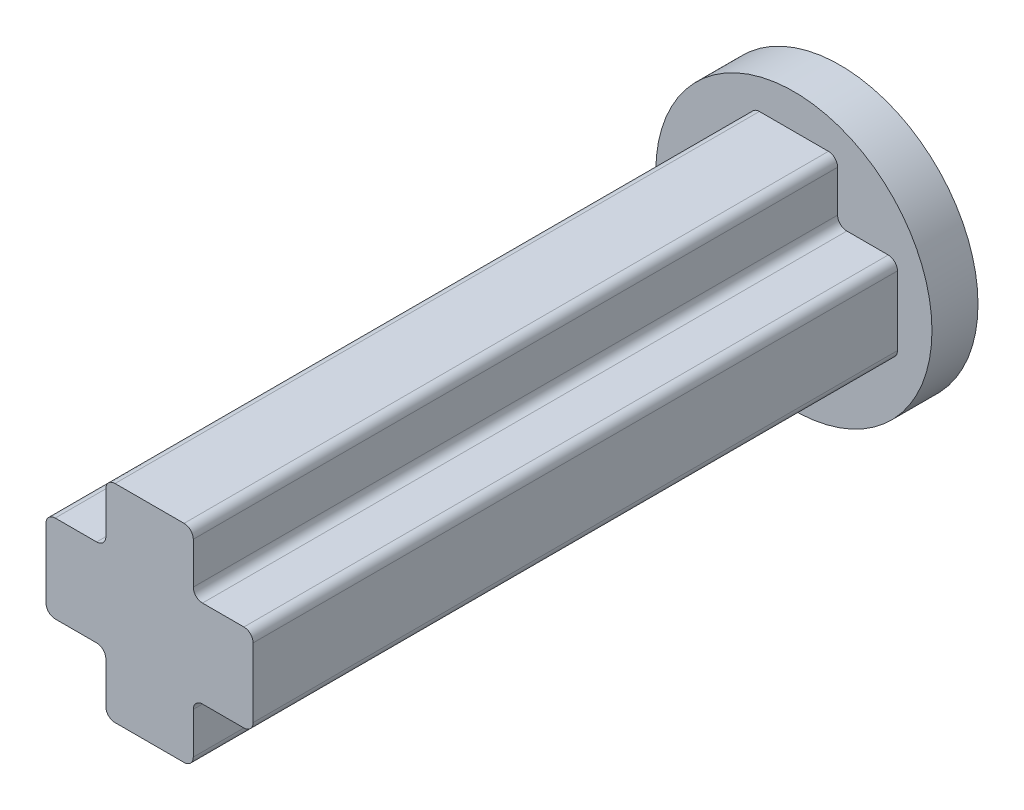
ISO-10303-21;
HEADER;
FILE_DESCRIPTION(('STEP AP214'),'2;1');
FILE_NAME('part.step','',(''),(''),'','','');
FILE_SCHEMA(('AUTOMOTIVE_DESIGN { 1 0 10303 214 1 1 1 1 }'));
ENDSEC;
DATA;
#1=APPLICATION_CONTEXT('core data for automotive mechanical design processes');
#2=APPLICATION_PROTOCOL_DEFINITION('international standard','automotive_design',2000,#1);
#3=PRODUCT_CONTEXT('',#1,'mechanical');
#4=PRODUCT('Part','Part','',(#3));
#5=PRODUCT_RELATED_PRODUCT_CATEGORY('part','',(#4));
#6=PRODUCT_DEFINITION_FORMATION('','',#4);
#7=PRODUCT_DEFINITION_CONTEXT('part definition',#1,'design');
#8=PRODUCT_DEFINITION('design','',#6,#7);
#9=PRODUCT_DEFINITION_SHAPE('','',#8);
#10=(LENGTH_UNIT() NAMED_UNIT(*) SI_UNIT(.MILLI.,.METRE.));
#11=(NAMED_UNIT(*) PLANE_ANGLE_UNIT() SI_UNIT($,.RADIAN.));
#12=(NAMED_UNIT(*) SI_UNIT($,.STERADIAN.) SOLID_ANGLE_UNIT());
#13=UNCERTAINTY_MEASURE_WITH_UNIT(LENGTH_MEASURE(1.E-05),#10,'distance_accuracy_value','');
#14=(GEOMETRIC_REPRESENTATION_CONTEXT(3) GLOBAL_UNCERTAINTY_ASSIGNED_CONTEXT((#13)) GLOBAL_UNIT_ASSIGNED_CONTEXT((#10,
#11,#12)) REPRESENTATION_CONTEXT('',''));
#15=CARTESIAN_POINT('',(0.,0.,0.));
#16=DIRECTION('',(0.,0.,1.));
#17=DIRECTION('',(1.,0.,0.));
#18=AXIS2_PLACEMENT_3D('',#15,#16,#17);
#19=CARTESIAN_POINT('',(0.,0.,1.));
#20=DIRECTION('',(0.,0.,-1.));
#21=DIRECTION('',(-1.,0.,0.));
#22=AXIS2_PLACEMENT_3D('',#19,#20,#21);
#23=CYLINDRICAL_SURFACE('',#22,3.);
#24=CARTESIAN_POINT('',(0.,0.,1.));
#25=DIRECTION('',(0.,0.,1.));
#26=DIRECTION('',(1.,0.,0.));
#27=AXIS2_PLACEMENT_3D('',#24,#25,#26);
#28=CIRCLE('',#27,3.);
#29=CARTESIAN_POINT('',(3.,0.,1.));
#30=VERTEX_POINT('',#29);
#31=EDGE_CURVE('E11',#30,#30,#28,.T.);
#32=ORIENTED_EDGE('',*,*,#31,.F.);
#33=EDGE_LOOP('',(#32));
#34=FACE_BOUND('',#33,.T.);
#35=CARTESIAN_POINT('',(0.,0.,0.));
#36=DIRECTION('',(0.,0.,1.));
#37=DIRECTION('',(1.,0.,0.));
#38=AXIS2_PLACEMENT_3D('',#35,#36,#37);
#39=CIRCLE('',#38,3.);
#40=CARTESIAN_POINT('',(3.,0.,0.));
#41=VERTEX_POINT('',#40);
#42=EDGE_CURVE('E45',#41,#41,#39,.T.);
#43=ORIENTED_EDGE('',*,*,#42,.T.);
#44=EDGE_LOOP('',(#43));
#45=FACE_BOUND('',#44,.T.);
#46=ADVANCED_FACE('F39',(#34,#45),#23,.T.);
#47=CARTESIAN_POINT('',(0.,0.,1.));
#48=DIRECTION('',(0.,0.,1.));
#49=DIRECTION('',(1.,0.,0.));
#50=AXIS2_PLACEMENT_3D('',#47,#48,#49);
#51=PLANE('',#50);
#52=CARTESIAN_POINT('',(2.05,-0.749999999999991,1.));
#53=DIRECTION('',(0.,0.,1.));
#54=DIRECTION('',(1.,0.,0.));
#55=AXIS2_PLACEMENT_3D('',#52,#53,#54);
#56=CIRCLE('',#55,0.2);
#57=CARTESIAN_POINT('',(2.05,-0.949999999999991,1.));
#58=VERTEX_POINT('',#57);
#59=CARTESIAN_POINT('',(2.25,-0.749999999999989,1.));
#60=VERTEX_POINT('',#59);
#61=EDGE_CURVE('E52',#58,#60,#56,.T.);
#62=ORIENTED_EDGE('',*,*,#61,.F.);
#63=DIRECTION('',(-1.,0.,0.));
#64=VECTOR('',#63,1.);
#65=CARTESIAN_POINT('',(2.05,-0.949999999999991,1.));
#66=LINE('',#65,#64);
#67=CARTESIAN_POINT('',(1.15,-0.949999999999995,1.));
#68=VERTEX_POINT('',#67);
#69=EDGE_CURVE('E289',#58,#68,#66,.T.);
#70=ORIENTED_EDGE('',*,*,#69,.T.);
#71=CARTESIAN_POINT('',(1.15,-1.15,1.));
#72=DIRECTION('',(0.,0.,1.));
#73=DIRECTION('',(1.,0.,0.));
#74=AXIS2_PLACEMENT_3D('',#71,#72,#73);
#75=CIRCLE('',#74,0.2);
#76=CARTESIAN_POINT('',(0.950000000000004,-1.15,1.));
#77=VERTEX_POINT('',#76);
#78=EDGE_CURVE('E286',#68,#77,#75,.T.);
#79=ORIENTED_EDGE('',*,*,#78,.T.);
#80=DIRECTION('',(0.,-1.,0.));
#81=VECTOR('',#80,1.);
#82=CARTESIAN_POINT('',(0.950000000000004,-1.15,1.));
#83=LINE('',#82,#81);
#84=CARTESIAN_POINT('',(0.950000000000008,-2.04999999999999,1.));
#85=VERTEX_POINT('',#84);
#86=EDGE_CURVE('E209',#77,#85,#83,.T.);
#87=ORIENTED_EDGE('',*,*,#86,.T.);
#88=CARTESIAN_POINT('',(0.750000000000008,-2.05,1.));
#89=DIRECTION('',(0.,0.,1.));
#90=DIRECTION('',(1.,0.,0.));
#91=AXIS2_PLACEMENT_3D('',#88,#89,#90);
#92=CIRCLE('',#91,0.2);
#93=CARTESIAN_POINT('',(0.750000000000007,-2.25,1.));
#94=VERTEX_POINT('',#93);
#95=EDGE_CURVE('E281',#94,#85,#92,.T.);
#96=ORIENTED_EDGE('',*,*,#95,.F.);
#97=DIRECTION('',(-1.,0.,0.));
#98=VECTOR('',#97,1.);
#99=CARTESIAN_POINT('',(0.750000000000007,-2.25,1.));
#100=LINE('',#99,#98);
#101=CARTESIAN_POINT('',(-0.749999999999998,-2.25,1.));
#102=VERTEX_POINT('',#101);
#103=EDGE_CURVE('E282',#94,#102,#100,.T.);
#104=ORIENTED_EDGE('',*,*,#103,.T.);
#105=CARTESIAN_POINT('',(-0.75,-2.05,1.));
#106=DIRECTION('',(0.,0.,1.));
#107=DIRECTION('',(1.,0.,0.));
#108=AXIS2_PLACEMENT_3D('',#105,#106,#107);
#109=CIRCLE('',#108,0.2);
#110=CARTESIAN_POINT('',(-0.95,-2.05,1.));
#111=VERTEX_POINT('',#110);
#112=EDGE_CURVE('E277',#111,#102,#109,.T.);
#113=ORIENTED_EDGE('',*,*,#112,.F.);
#114=DIRECTION('',(0.,-1.,0.));
#115=VECTOR('',#114,1.);
#116=CARTESIAN_POINT('',(-0.95,-1.15,1.));
#117=LINE('',#116,#115);
#118=CARTESIAN_POINT('',(-0.95,-1.15,1.));
#119=VERTEX_POINT('',#118);
#120=EDGE_CURVE('E276',#119,#111,#117,.T.);
#121=ORIENTED_EDGE('',*,*,#120,.F.);
#122=CARTESIAN_POINT('',(-1.15,-1.15,1.));
#123=DIRECTION('',(0.,0.,-1.));
#124=DIRECTION('',(-1.,0.,0.));
#125=AXIS2_PLACEMENT_3D('',#122,#123,#124);
#126=CIRCLE('',#125,0.2);
#127=CARTESIAN_POINT('',(-1.15,-0.949999999999996,1.));
#128=VERTEX_POINT('',#127);
#129=EDGE_CURVE('E272',#128,#119,#126,.T.);
#130=ORIENTED_EDGE('',*,*,#129,.F.);
#131=DIRECTION('',(1.,0.,0.));
#132=VECTOR('',#131,1.);
#133=CARTESIAN_POINT('',(-2.05,-0.949999999999996,1.));
#134=LINE('',#133,#132);
#135=CARTESIAN_POINT('',(-2.05,-0.949999999999996,1.));
#136=VERTEX_POINT('',#135);
#137=EDGE_CURVE('E275',#136,#128,#134,.T.);
#138=ORIENTED_EDGE('',*,*,#137,.F.);
#139=CARTESIAN_POINT('',(-2.05,-0.749999999999996,1.));
#140=DIRECTION('',(0.,0.,1.));
#141=DIRECTION('',(1.,0.,0.));
#142=AXIS2_PLACEMENT_3D('',#139,#140,#141);
#143=CIRCLE('',#142,0.2);
#144=CARTESIAN_POINT('',(-2.25,-0.749999999999995,1.));
#145=VERTEX_POINT('',#144);
#146=EDGE_CURVE('E269',#145,#136,#143,.T.);
#147=ORIENTED_EDGE('',*,*,#146,.F.);
#148=DIRECTION('',(0.,1.,0.));
#149=VECTOR('',#148,1.);
#150=CARTESIAN_POINT('',(-2.25,-0.749999999999995,1.));
#151=LINE('',#150,#149);
#152=CARTESIAN_POINT('',(-2.25,0.749999999999998,1.));
#153=VERTEX_POINT('',#152);
#154=EDGE_CURVE('E270',#145,#153,#151,.T.);
#155=ORIENTED_EDGE('',*,*,#154,.T.);
#156=CARTESIAN_POINT('',(-2.05,0.75,1.));
#157=DIRECTION('',(0.,0.,-1.));
#158=DIRECTION('',(-1.,0.,0.));
#159=AXIS2_PLACEMENT_3D('',#156,#157,#158);
#160=CIRCLE('',#159,0.2);
#161=CARTESIAN_POINT('',(-2.05,0.95,1.));
#162=VERTEX_POINT('',#161);
#163=EDGE_CURVE('E264',#153,#162,#160,.T.);
#164=ORIENTED_EDGE('',*,*,#163,.T.);
#165=DIRECTION('',(-1.,0.,0.));
#166=VECTOR('',#165,1.);
#167=CARTESIAN_POINT('',(-1.15,0.95,1.));
#168=LINE('',#167,#166);
#169=CARTESIAN_POINT('',(-1.15,0.95,1.));
#170=VERTEX_POINT('',#169);
#171=EDGE_CURVE('E263',#170,#162,#168,.T.);
#172=ORIENTED_EDGE('',*,*,#171,.F.);
#173=CARTESIAN_POINT('',(-1.15,1.15,1.));
#174=DIRECTION('',(0.,0.,-1.));
#175=DIRECTION('',(-1.,0.,0.));
#176=AXIS2_PLACEMENT_3D('',#173,#174,#175);
#177=CIRCLE('',#176,0.2);
#178=CARTESIAN_POINT('',(-0.95,1.15,1.));
#179=VERTEX_POINT('',#178);
#180=EDGE_CURVE('E260',#179,#170,#177,.T.);
#181=ORIENTED_EDGE('',*,*,#180,.F.);
#182=DIRECTION('',(0.,-1.,0.));
#183=VECTOR('',#182,1.);
#184=CARTESIAN_POINT('',(-0.95,2.05,1.));
#185=LINE('',#184,#183);
#186=CARTESIAN_POINT('',(-0.95,2.05,1.));
#187=VERTEX_POINT('',#186);
#188=EDGE_CURVE('E257',#187,#179,#185,.T.);
#189=ORIENTED_EDGE('',*,*,#188,.F.);
#190=CARTESIAN_POINT('',(-0.75,2.05,1.));
#191=DIRECTION('',(0.,0.,-1.));
#192=DIRECTION('',(-1.,0.,0.));
#193=AXIS2_PLACEMENT_3D('',#190,#191,#192);
#194=CIRCLE('',#193,0.2);
#195=CARTESIAN_POINT('',(-0.749999999999999,2.25,1.));
#196=VERTEX_POINT('',#195);
#197=EDGE_CURVE('E252',#187,#196,#194,.T.);
#198=ORIENTED_EDGE('',*,*,#197,.T.);
#199=DIRECTION('',(1.,0.,0.));
#200=VECTOR('',#199,1.);
#201=CARTESIAN_POINT('',(-0.749999999999999,2.25,1.));
#202=LINE('',#201,#200);
#203=CARTESIAN_POINT('',(0.750000000000002,2.25,1.));
#204=VERTEX_POINT('',#203);
#205=EDGE_CURVE('E253',#196,#204,#202,.T.);
#206=ORIENTED_EDGE('',*,*,#205,.T.);
#207=CARTESIAN_POINT('',(0.750000000000003,2.05,1.));
#208=DIRECTION('',(0.,0.,-1.));
#209=DIRECTION('',(-1.,0.,0.));
#210=AXIS2_PLACEMENT_3D('',#207,#208,#209);
#211=CIRCLE('',#210,0.2);
#212=CARTESIAN_POINT('',(0.950000000000004,2.05,1.));
#213=VERTEX_POINT('',#212);
#214=EDGE_CURVE('E246',#204,#213,#211,.T.);
#215=ORIENTED_EDGE('',*,*,#214,.T.);
#216=DIRECTION('',(0.,-1.,0.));
#217=VECTOR('',#216,1.);
#218=CARTESIAN_POINT('',(0.950000000000004,2.05,1.));
#219=LINE('',#218,#217);
#220=CARTESIAN_POINT('',(0.950000000000004,1.15,1.));
#221=VERTEX_POINT('',#220);
#222=EDGE_CURVE('E244',#213,#221,#219,.T.);
#223=ORIENTED_EDGE('',*,*,#222,.T.);
#224=CARTESIAN_POINT('',(1.15,1.15,1.));
#225=DIRECTION('',(0.,0.,1.));
#226=DIRECTION('',(1.,0.,0.));
#227=AXIS2_PLACEMENT_3D('',#224,#225,#226);
#228=CIRCLE('',#227,0.2);
#229=CARTESIAN_POINT('',(1.15,0.95,1.));
#230=VERTEX_POINT('',#229);
#231=EDGE_CURVE('E245',#221,#230,#228,.T.);
#232=ORIENTED_EDGE('',*,*,#231,.T.);
#233=DIRECTION('',(1.,0.,0.));
#234=VECTOR('',#233,1.);
#235=CARTESIAN_POINT('',(1.15000000000001,0.95,1.));
#236=LINE('',#235,#234);
#237=CARTESIAN_POINT('',(2.05,0.95,1.));
#238=VERTEX_POINT('',#237);
#239=EDGE_CURVE('E236',#230,#238,#236,.T.);
#240=ORIENTED_EDGE('',*,*,#239,.T.);
#241=CARTESIAN_POINT('',(2.05,0.75,1.));
#242=DIRECTION('',(0.,0.,-1.));
#243=DIRECTION('',(-1.,0.,0.));
#244=AXIS2_PLACEMENT_3D('',#241,#242,#243);
#245=CIRCLE('',#244,0.2);
#246=CARTESIAN_POINT('',(2.25,0.749999999999999,1.));
#247=VERTEX_POINT('',#246);
#248=EDGE_CURVE('E237',#238,#247,#245,.T.);
#249=ORIENTED_EDGE('',*,*,#248,.T.);
#250=DIRECTION('',(0.,-1.,0.));
#251=VECTOR('',#250,1.);
#252=CARTESIAN_POINT('',(2.25,0.749999999999999,1.));
#253=LINE('',#252,#251);
#254=EDGE_CURVE('E232',#247,#60,#253,.T.);
#255=ORIENTED_EDGE('',*,*,#254,.T.);
#256=EDGE_LOOP('',(#62,#70,#79,#87,#96,#104,#113,#121,#130,#138,#147,#155,#164,#172,#181,#189,
#198,#206,#215,#223,#232,#240,#249,#255));
#257=FACE_BOUND('',#256,.T.);
#258=ORIENTED_EDGE('',*,*,#31,.T.);
#259=EDGE_LOOP('',(#258));
#260=FACE_BOUND('',#259,.T.);
#261=ADVANCED_FACE('F353',(#257,#260),#51,.T.);
#262=CARTESIAN_POINT('',(0.,0.,0.));
#263=DIRECTION('',(0.,0.,1.));
#264=DIRECTION('',(1.,0.,0.));
#265=AXIS2_PLACEMENT_3D('',#262,#263,#264);
#266=PLANE('',#265);
#267=ORIENTED_EDGE('',*,*,#42,.F.);
#268=EDGE_LOOP('',(#267));
#269=FACE_BOUND('',#268,.T.);
#270=ADVANCED_FACE('F346',(#269),#266,.F.);
#271=CARTESIAN_POINT('',(2.05,-0.749999999999991,15.));
#272=DIRECTION('',(0.,0.,-1.));
#273=DIRECTION('',(-1.,0.,0.));
#274=AXIS2_PLACEMENT_3D('',#271,#272,#273);
#275=CYLINDRICAL_SURFACE('',#274,0.2);
#276=ORIENTED_EDGE('',*,*,#61,.T.);
#277=DIRECTION('',(0.,0.,-1.));
#278=VECTOR('',#277,1.);
#279=CARTESIAN_POINT('',(2.25,-0.749999999999989,15.));
#280=LINE('',#279,#278);
#281=CARTESIAN_POINT('',(2.25,-0.749999999999989,15.));
#282=VERTEX_POINT('',#281);
#283=EDGE_CURVE('E338',#282,#60,#280,.T.);
#284=ORIENTED_EDGE('',*,*,#283,.F.);
#285=CARTESIAN_POINT('',(2.05,-0.749999999999991,15.));
#286=DIRECTION('',(0.,0.,1.));
#287=DIRECTION('',(1.,0.,0.));
#288=AXIS2_PLACEMENT_3D('',#285,#286,#287);
#289=CIRCLE('',#288,0.2);
#290=CARTESIAN_POINT('',(2.05,-0.949999999999991,15.));
#291=VERTEX_POINT('',#290);
#292=EDGE_CURVE('E141',#291,#282,#289,.T.);
#293=ORIENTED_EDGE('',*,*,#292,.F.);
#294=DIRECTION('',(0.,0.,-1.));
#295=VECTOR('',#294,1.);
#296=CARTESIAN_POINT('',(2.05,-0.949999999999991,15.));
#297=LINE('',#296,#295);
#298=EDGE_CURVE('E63',#291,#58,#297,.T.);
#299=ORIENTED_EDGE('',*,*,#298,.T.);
#300=EDGE_LOOP('',(#276,#284,#293,#299));
#301=FACE_BOUND('',#300,.T.);
#302=ADVANCED_FACE('F349',(#301),#275,.T.);
#303=CARTESIAN_POINT('',(2.25,0.749999999999999,15.));
#304=DIRECTION('',(1.,0.,0.));
#305=DIRECTION('',(0.,1.,0.));
#306=AXIS2_PLACEMENT_3D('',#303,#304,#305);
#307=PLANE('',#306);
#308=ORIENTED_EDGE('',*,*,#254,.F.);
#309=DIRECTION('',(0.,0.,-1.));
#310=VECTOR('',#309,1.);
#311=CARTESIAN_POINT('',(2.25,0.749999999999999,15.));
#312=LINE('',#311,#310);
#313=CARTESIAN_POINT('',(2.25,0.749999999999999,15.));
#314=VERTEX_POINT('',#313);
#315=EDGE_CURVE('E336',#314,#247,#312,.T.);
#316=ORIENTED_EDGE('',*,*,#315,.F.);
#317=DIRECTION('',(0.,-1.,0.));
#318=VECTOR('',#317,1.);
#319=CARTESIAN_POINT('',(2.25,0.749999999999999,15.));
#320=LINE('',#319,#318);
#321=EDGE_CURVE('E616',#314,#282,#320,.T.);
#322=ORIENTED_EDGE('',*,*,#321,.T.);
#323=ORIENTED_EDGE('',*,*,#283,.T.);
#324=EDGE_LOOP('',(#308,#316,#322,#323));
#325=FACE_BOUND('',#324,.T.);
#326=ADVANCED_FACE('F360',(#325),#307,.T.);
#327=CARTESIAN_POINT('',(2.05,0.75,15.));
#328=DIRECTION('',(0.,0.,-1.));
#329=DIRECTION('',(-1.,0.,0.));
#330=AXIS2_PLACEMENT_3D('',#327,#328,#329);
#331=CYLINDRICAL_SURFACE('',#330,0.2);
#332=ORIENTED_EDGE('',*,*,#248,.F.);
#333=DIRECTION('',(0.,0.,-1.));
#334=VECTOR('',#333,1.);
#335=CARTESIAN_POINT('',(2.05,0.95,15.));
#336=LINE('',#335,#334);
#337=CARTESIAN_POINT('',(2.05,0.95,15.));
#338=VERTEX_POINT('',#337);
#339=EDGE_CURVE('E337',#338,#238,#336,.T.);
#340=ORIENTED_EDGE('',*,*,#339,.F.);
#341=CARTESIAN_POINT('',(2.05,0.75,15.));
#342=DIRECTION('',(0.,0.,-1.));
#343=DIRECTION('',(-1.,0.,0.));
#344=AXIS2_PLACEMENT_3D('',#341,#342,#343);
#345=CIRCLE('',#344,0.2);
#346=EDGE_CURVE('E625',#338,#314,#345,.T.);
#347=ORIENTED_EDGE('',*,*,#346,.T.);
#348=ORIENTED_EDGE('',*,*,#315,.T.);
#349=EDGE_LOOP('',(#332,#340,#347,#348));
#350=FACE_BOUND('',#349,.T.);
#351=ADVANCED_FACE('F392',(#350),#331,.T.);
#352=CARTESIAN_POINT('',(1.15000000000001,0.95,15.));
#353=DIRECTION('',(0.,1.,0.));
#354=DIRECTION('',(0.,0.,1.));
#355=AXIS2_PLACEMENT_3D('',#352,#353,#354);
#356=PLANE('',#355);
#357=ORIENTED_EDGE('',*,*,#239,.F.);
#358=DIRECTION('',(0.,0.,-1.));
#359=VECTOR('',#358,1.);
#360=CARTESIAN_POINT('',(1.15,0.95,15.));
#361=LINE('',#360,#359);
#362=CARTESIAN_POINT('',(1.15,0.95,15.));
#363=VERTEX_POINT('',#362);
#364=EDGE_CURVE('E332',#363,#230,#361,.T.);
#365=ORIENTED_EDGE('',*,*,#364,.F.);
#366=DIRECTION('',(1.,0.,0.));
#367=VECTOR('',#366,1.);
#368=CARTESIAN_POINT('',(1.15000000000001,0.95,15.));
#369=LINE('',#368,#367);
#370=EDGE_CURVE('E622',#363,#338,#369,.T.);
#371=ORIENTED_EDGE('',*,*,#370,.T.);
#372=ORIENTED_EDGE('',*,*,#339,.T.);
#373=EDGE_LOOP('',(#357,#365,#371,#372));
#374=FACE_BOUND('',#373,.T.);
#375=ADVANCED_FACE('F401',(#374),#356,.T.);
#376=CARTESIAN_POINT('',(1.15,1.15,15.));
#377=DIRECTION('',(0.,0.,-1.));
#378=DIRECTION('',(-1.,0.,0.));
#379=AXIS2_PLACEMENT_3D('',#376,#377,#378);
#380=CYLINDRICAL_SURFACE('',#379,0.2);
#381=ORIENTED_EDGE('',*,*,#231,.F.);
#382=DIRECTION('',(0.,0.,-1.));
#383=VECTOR('',#382,1.);
#384=CARTESIAN_POINT('',(0.950000000000004,1.15,15.));
#385=LINE('',#384,#383);
#386=CARTESIAN_POINT('',(0.950000000000004,1.15,15.));
#387=VERTEX_POINT('',#386);
#388=EDGE_CURVE('E335',#387,#221,#385,.T.);
#389=ORIENTED_EDGE('',*,*,#388,.F.);
#390=CARTESIAN_POINT('',(1.15,1.15,15.));
#391=DIRECTION('',(0.,0.,1.));
#392=DIRECTION('',(1.,0.,0.));
#393=AXIS2_PLACEMENT_3D('',#390,#391,#392);
#394=CIRCLE('',#393,0.2);
#395=EDGE_CURVE('E630',#387,#363,#394,.T.);
#396=ORIENTED_EDGE('',*,*,#395,.T.);
#397=ORIENTED_EDGE('',*,*,#364,.T.);
#398=EDGE_LOOP('',(#381,#389,#396,#397));
#399=FACE_BOUND('',#398,.T.);
#400=ADVANCED_FACE('F411',(#399),#380,.F.);
#401=CARTESIAN_POINT('',(0.950000000000004,2.05,15.));
#402=DIRECTION('',(1.,0.,0.));
#403=DIRECTION('',(0.,0.,-1.));
#404=AXIS2_PLACEMENT_3D('',#401,#402,#403);
#405=PLANE('',#404);
#406=ORIENTED_EDGE('',*,*,#222,.F.);
#407=DIRECTION('',(0.,0.,-1.));
#408=VECTOR('',#407,1.);
#409=CARTESIAN_POINT('',(0.950000000000004,2.05,15.));
#410=LINE('',#409,#408);
#411=CARTESIAN_POINT('',(0.950000000000004,2.05,15.));
#412=VERTEX_POINT('',#411);
#413=EDGE_CURVE('E328',#412,#213,#410,.T.);
#414=ORIENTED_EDGE('',*,*,#413,.F.);
#415=DIRECTION('',(0.,-1.,0.));
#416=VECTOR('',#415,1.);
#417=CARTESIAN_POINT('',(0.950000000000004,2.05,15.));
#418=LINE('',#417,#416);
#419=EDGE_CURVE('E633',#412,#387,#418,.T.);
#420=ORIENTED_EDGE('',*,*,#419,.T.);
#421=ORIENTED_EDGE('',*,*,#388,.T.);
#422=EDGE_LOOP('',(#406,#414,#420,#421));
#423=FACE_BOUND('',#422,.T.);
#424=ADVANCED_FACE('F423',(#423),#405,.T.);
#425=CARTESIAN_POINT('',(0.750000000000003,2.05,15.));
#426=DIRECTION('',(0.,0.,-1.));
#427=DIRECTION('',(-1.,0.,0.));
#428=AXIS2_PLACEMENT_3D('',#425,#426,#427);
#429=CYLINDRICAL_SURFACE('',#428,0.2);
#430=ORIENTED_EDGE('',*,*,#214,.F.);
#431=DIRECTION('',(0.,0.,-1.));
#432=VECTOR('',#431,1.);
#433=CARTESIAN_POINT('',(0.750000000000002,2.25,15.));
#434=LINE('',#433,#432);
#435=CARTESIAN_POINT('',(0.750000000000002,2.25,15.));
#436=VERTEX_POINT('',#435);
#437=EDGE_CURVE('E329',#436,#204,#434,.T.);
#438=ORIENTED_EDGE('',*,*,#437,.F.);
#439=CARTESIAN_POINT('',(0.750000000000003,2.05,15.));
#440=DIRECTION('',(0.,0.,-1.));
#441=DIRECTION('',(-1.,0.,0.));
#442=AXIS2_PLACEMENT_3D('',#439,#440,#441);
#443=CIRCLE('',#442,0.2);
#444=EDGE_CURVE('E636',#436,#412,#443,.T.);
#445=ORIENTED_EDGE('',*,*,#444,.T.);
#446=ORIENTED_EDGE('',*,*,#413,.T.);
#447=EDGE_LOOP('',(#430,#438,#445,#446));
#448=FACE_BOUND('',#447,.T.);
#449=ADVANCED_FACE('F433',(#448),#429,.T.);
#450=CARTESIAN_POINT('',(-0.749999999999999,2.25,15.));
#451=DIRECTION('',(0.,1.,0.));
#452=DIRECTION('',(0.,0.,1.));
#453=AXIS2_PLACEMENT_3D('',#450,#451,#452);
#454=PLANE('',#453);
#455=ORIENTED_EDGE('',*,*,#205,.F.);
#456=DIRECTION('',(0.,0.,-1.));
#457=VECTOR('',#456,1.);
#458=CARTESIAN_POINT('',(-0.749999999999999,2.25,15.));
#459=LINE('',#458,#457);
#460=CARTESIAN_POINT('',(-0.749999999999999,2.25,15.));
#461=VERTEX_POINT('',#460);
#462=EDGE_CURVE('E327',#461,#196,#459,.T.);
#463=ORIENTED_EDGE('',*,*,#462,.F.);
#464=DIRECTION('',(1.,0.,0.));
#465=VECTOR('',#464,1.);
#466=CARTESIAN_POINT('',(-0.749999999999999,2.25,15.));
#467=LINE('',#466,#465);
#468=EDGE_CURVE('E638',#461,#436,#467,.T.);
#469=ORIENTED_EDGE('',*,*,#468,.T.);
#470=ORIENTED_EDGE('',*,*,#437,.T.);
#471=EDGE_LOOP('',(#455,#463,#469,#470));
#472=FACE_BOUND('',#471,.T.);
#473=ADVANCED_FACE('F443',(#472),#454,.T.);
#474=CARTESIAN_POINT('',(-0.75,2.05,15.));
#475=DIRECTION('',(0.,0.,-1.));
#476=DIRECTION('',(-1.,0.,0.));
#477=AXIS2_PLACEMENT_3D('',#474,#475,#476);
#478=CYLINDRICAL_SURFACE('',#477,0.2);
#479=ORIENTED_EDGE('',*,*,#197,.F.);
#480=DIRECTION('',(0.,0.,-1.));
#481=VECTOR('',#480,1.);
#482=CARTESIAN_POINT('',(-0.95,2.05,15.));
#483=LINE('',#482,#481);
#484=CARTESIAN_POINT('',(-0.95,2.05,15.));
#485=VERTEX_POINT('',#484);
#486=EDGE_CURVE('E323',#485,#187,#483,.T.);
#487=ORIENTED_EDGE('',*,*,#486,.F.);
#488=CARTESIAN_POINT('',(-0.75,2.05,15.));
#489=DIRECTION('',(0.,0.,-1.));
#490=DIRECTION('',(-1.,0.,0.));
#491=AXIS2_PLACEMENT_3D('',#488,#489,#490);
#492=CIRCLE('',#491,0.2);
#493=EDGE_CURVE('E645',#485,#461,#492,.T.);
#494=ORIENTED_EDGE('',*,*,#493,.T.);
#495=ORIENTED_EDGE('',*,*,#462,.T.);
#496=EDGE_LOOP('',(#479,#487,#494,#495));
#497=FACE_BOUND('',#496,.T.);
#498=ADVANCED_FACE('F451',(#497),#478,.T.);
#499=CARTESIAN_POINT('',(-0.95,2.05,15.));
#500=DIRECTION('',(1.,0.,0.));
#501=DIRECTION('',(0.,0.,-1.));
#502=AXIS2_PLACEMENT_3D('',#499,#500,#501);
#503=PLANE('',#502);
#504=ORIENTED_EDGE('',*,*,#188,.T.);
#505=DIRECTION('',(0.,0.,-1.));
#506=VECTOR('',#505,1.);
#507=CARTESIAN_POINT('',(-0.95,1.15,15.));
#508=LINE('',#507,#506);
#509=CARTESIAN_POINT('',(-0.95,1.15,15.));
#510=VERTEX_POINT('',#509);
#511=EDGE_CURVE('E321',#510,#179,#508,.T.);
#512=ORIENTED_EDGE('',*,*,#511,.F.);
#513=DIRECTION('',(0.,-1.,0.));
#514=VECTOR('',#513,1.);
#515=CARTESIAN_POINT('',(-0.95,2.05,15.));
#516=LINE('',#515,#514);
#517=EDGE_CURVE('E643',#485,#510,#516,.T.);
#518=ORIENTED_EDGE('',*,*,#517,.F.);
#519=ORIENTED_EDGE('',*,*,#486,.T.);
#520=EDGE_LOOP('',(#504,#512,#518,#519));
#521=FACE_BOUND('',#520,.T.);
#522=ADVANCED_FACE('F462',(#521),#503,.F.);
#523=CARTESIAN_POINT('',(-1.15,1.15,15.));
#524=DIRECTION('',(0.,0.,-1.));
#525=DIRECTION('',(-1.,0.,0.));
#526=AXIS2_PLACEMENT_3D('',#523,#524,#525);
#527=CYLINDRICAL_SURFACE('',#526,0.2);
#528=ORIENTED_EDGE('',*,*,#180,.T.);
#529=DIRECTION('',(0.,0.,-1.));
#530=VECTOR('',#529,1.);
#531=CARTESIAN_POINT('',(-1.15,0.95,15.));
#532=LINE('',#531,#530);
#533=CARTESIAN_POINT('',(-1.15,0.95,15.));
#534=VERTEX_POINT('',#533);
#535=EDGE_CURVE('E318',#534,#170,#532,.T.);
#536=ORIENTED_EDGE('',*,*,#535,.F.);
#537=CARTESIAN_POINT('',(-1.15,1.15,15.));
#538=DIRECTION('',(0.,0.,-1.));
#539=DIRECTION('',(-1.,0.,0.));
#540=AXIS2_PLACEMENT_3D('',#537,#538,#539);
#541=CIRCLE('',#540,0.2);
#542=EDGE_CURVE('E650',#510,#534,#541,.T.);
#543=ORIENTED_EDGE('',*,*,#542,.F.);
#544=ORIENTED_EDGE('',*,*,#511,.T.);
#545=EDGE_LOOP('',(#528,#536,#543,#544));
#546=FACE_BOUND('',#545,.T.);
#547=ADVANCED_FACE('F472',(#546),#527,.F.);
#548=CARTESIAN_POINT('',(-1.15,0.95,15.));
#549=DIRECTION('',(0.,-1.,0.));
#550=DIRECTION('',(0.,0.,-1.));
#551=AXIS2_PLACEMENT_3D('',#548,#549,#550);
#552=PLANE('',#551);
#553=ORIENTED_EDGE('',*,*,#171,.T.);
#554=DIRECTION('',(0.,0.,-1.));
#555=VECTOR('',#554,1.);
#556=CARTESIAN_POINT('',(-2.05,0.95,15.));
#557=LINE('',#556,#555);
#558=CARTESIAN_POINT('',(-2.05,0.95,15.));
#559=VERTEX_POINT('',#558);
#560=EDGE_CURVE('E316',#559,#162,#557,.T.);
#561=ORIENTED_EDGE('',*,*,#560,.F.);
#562=DIRECTION('',(-1.,0.,0.));
#563=VECTOR('',#562,1.);
#564=CARTESIAN_POINT('',(-1.15,0.95,15.));
#565=LINE('',#564,#563);
#566=EDGE_CURVE('E647',#534,#559,#565,.T.);
#567=ORIENTED_EDGE('',*,*,#566,.F.);
#568=ORIENTED_EDGE('',*,*,#535,.T.);
#569=EDGE_LOOP('',(#553,#561,#567,#568));
#570=FACE_BOUND('',#569,.T.);
#571=ADVANCED_FACE('F483',(#570),#552,.F.);
#572=CARTESIAN_POINT('',(-2.05,0.75,15.));
#573=DIRECTION('',(0.,0.,-1.));
#574=DIRECTION('',(-1.,0.,0.));
#575=AXIS2_PLACEMENT_3D('',#572,#573,#574);
#576=CYLINDRICAL_SURFACE('',#575,0.2);
#577=ORIENTED_EDGE('',*,*,#163,.F.);
#578=DIRECTION('',(0.,0.,-1.));
#579=VECTOR('',#578,1.);
#580=CARTESIAN_POINT('',(-2.25,0.749999999999998,15.));
#581=LINE('',#580,#579);
#582=CARTESIAN_POINT('',(-2.25,0.749999999999998,15.));
#583=VERTEX_POINT('',#582);
#584=EDGE_CURVE('E312',#583,#153,#581,.T.);
#585=ORIENTED_EDGE('',*,*,#584,.F.);
#586=CARTESIAN_POINT('',(-2.05,0.75,15.));
#587=DIRECTION('',(0.,0.,-1.));
#588=DIRECTION('',(-1.,0.,0.));
#589=AXIS2_PLACEMENT_3D('',#586,#587,#588);
#590=CIRCLE('',#589,0.2);
#591=EDGE_CURVE('E652',#583,#559,#590,.T.);
#592=ORIENTED_EDGE('',*,*,#591,.T.);
#593=ORIENTED_EDGE('',*,*,#560,.T.);
#594=EDGE_LOOP('',(#577,#585,#592,#593));
#595=FACE_BOUND('',#594,.T.);
#596=ADVANCED_FACE('F491',(#595),#576,.T.);
#597=CARTESIAN_POINT('',(-2.25,-0.749999999999995,15.));
#598=DIRECTION('',(-1.,0.,0.));
#599=DIRECTION('',(0.,0.,1.));
#600=AXIS2_PLACEMENT_3D('',#597,#598,#599);
#601=PLANE('',#600);
#602=ORIENTED_EDGE('',*,*,#154,.F.);
#603=DIRECTION('',(0.,0.,-1.));
#604=VECTOR('',#603,1.);
#605=CARTESIAN_POINT('',(-2.25,-0.749999999999995,15.));
#606=LINE('',#605,#604);
#607=CARTESIAN_POINT('',(-2.25,-0.749999999999995,15.));
#608=VERTEX_POINT('',#607);
#609=EDGE_CURVE('E315',#608,#145,#606,.T.);
#610=ORIENTED_EDGE('',*,*,#609,.F.);
#611=DIRECTION('',(0.,1.,0.));
#612=VECTOR('',#611,1.);
#613=CARTESIAN_POINT('',(-2.25,-0.749999999999995,15.));
#614=LINE('',#613,#612);
#615=EDGE_CURVE('E654',#608,#583,#614,.T.);
#616=ORIENTED_EDGE('',*,*,#615,.T.);
#617=ORIENTED_EDGE('',*,*,#584,.T.);
#618=EDGE_LOOP('',(#602,#610,#616,#617));
#619=FACE_BOUND('',#618,.T.);
#620=ADVANCED_FACE('F501',(#619),#601,.T.);
#621=CARTESIAN_POINT('',(-2.05,-0.749999999999996,15.));
#622=DIRECTION('',(0.,0.,-1.));
#623=DIRECTION('',(-1.,0.,0.));
#624=AXIS2_PLACEMENT_3D('',#621,#622,#623);
#625=CYLINDRICAL_SURFACE('',#624,0.2);
#626=ORIENTED_EDGE('',*,*,#146,.T.);
#627=DIRECTION('',(0.,0.,-1.));
#628=VECTOR('',#627,1.);
#629=CARTESIAN_POINT('',(-2.05,-0.949999999999996,15.));
#630=LINE('',#629,#628);
#631=CARTESIAN_POINT('',(-2.05,-0.949999999999996,15.));
#632=VERTEX_POINT('',#631);
#633=EDGE_CURVE('E309',#632,#136,#630,.T.);
#634=ORIENTED_EDGE('',*,*,#633,.F.);
#635=CARTESIAN_POINT('',(-2.05,-0.749999999999996,15.));
#636=DIRECTION('',(0.,0.,1.));
#637=DIRECTION('',(1.,0.,0.));
#638=AXIS2_PLACEMENT_3D('',#635,#636,#637);
#639=CIRCLE('',#638,0.2);
#640=EDGE_CURVE('E660',#608,#632,#639,.T.);
#641=ORIENTED_EDGE('',*,*,#640,.F.);
#642=ORIENTED_EDGE('',*,*,#609,.T.);
#643=EDGE_LOOP('',(#626,#634,#641,#642));
#644=FACE_BOUND('',#643,.T.);
#645=ADVANCED_FACE('F513',(#644),#625,.T.);
#646=CARTESIAN_POINT('',(-2.05,-0.949999999999996,15.));
#647=DIRECTION('',(0.,1.,0.));
#648=DIRECTION('',(0.,0.,1.));
#649=AXIS2_PLACEMENT_3D('',#646,#647,#648);
#650=PLANE('',#649);
#651=ORIENTED_EDGE('',*,*,#137,.T.);
#652=DIRECTION('',(0.,0.,-1.));
#653=VECTOR('',#652,1.);
#654=CARTESIAN_POINT('',(-1.15,-0.949999999999996,15.));
#655=LINE('',#654,#653);
#656=CARTESIAN_POINT('',(-1.15,-0.949999999999996,15.));
#657=VERTEX_POINT('',#656);
#658=EDGE_CURVE('E308',#657,#128,#655,.T.);
#659=ORIENTED_EDGE('',*,*,#658,.F.);
#660=DIRECTION('',(1.,0.,0.));
#661=VECTOR('',#660,1.);
#662=CARTESIAN_POINT('',(-2.05,-0.949999999999996,15.));
#663=LINE('',#662,#661);
#664=EDGE_CURVE('E657',#632,#657,#663,.T.);
#665=ORIENTED_EDGE('',*,*,#664,.F.);
#666=ORIENTED_EDGE('',*,*,#633,.T.);
#667=EDGE_LOOP('',(#651,#659,#665,#666));
#668=FACE_BOUND('',#667,.T.);
#669=ADVANCED_FACE('F523',(#668),#650,.F.);
#670=CARTESIAN_POINT('',(-1.15,-1.15,15.));
#671=DIRECTION('',(0.,0.,-1.));
#672=DIRECTION('',(-1.,0.,0.));
#673=AXIS2_PLACEMENT_3D('',#670,#671,#672);
#674=CYLINDRICAL_SURFACE('',#673,0.2);
#675=ORIENTED_EDGE('',*,*,#129,.T.);
#676=DIRECTION('',(0.,0.,-1.));
#677=VECTOR('',#676,1.);
#678=CARTESIAN_POINT('',(-0.95,-1.15,15.));
#679=LINE('',#678,#677);
#680=CARTESIAN_POINT('',(-0.95,-1.15,15.));
#681=VERTEX_POINT('',#680);
#682=EDGE_CURVE('E301',#681,#119,#679,.T.);
#683=ORIENTED_EDGE('',*,*,#682,.F.);
#684=CARTESIAN_POINT('',(-1.15,-1.15,15.));
#685=DIRECTION('',(0.,0.,-1.));
#686=DIRECTION('',(-1.,0.,0.));
#687=AXIS2_PLACEMENT_3D('',#684,#685,#686);
#688=CIRCLE('',#687,0.2);
#689=EDGE_CURVE('E663',#657,#681,#688,.T.);
#690=ORIENTED_EDGE('',*,*,#689,.F.);
#691=ORIENTED_EDGE('',*,*,#658,.T.);
#692=EDGE_LOOP('',(#675,#683,#690,#691));
#693=FACE_BOUND('',#692,.T.);
#694=ADVANCED_FACE('F533',(#693),#674,.F.);
#695=CARTESIAN_POINT('',(-0.95,-1.15,15.));
#696=DIRECTION('',(1.,0.,0.));
#697=DIRECTION('',(0.,0.,-1.));
#698=AXIS2_PLACEMENT_3D('',#695,#696,#697);
#699=PLANE('',#698);
#700=ORIENTED_EDGE('',*,*,#120,.T.);
#701=DIRECTION('',(0.,0.,-1.));
#702=VECTOR('',#701,1.);
#703=CARTESIAN_POINT('',(-0.95,-2.05,15.));
#704=LINE('',#703,#702);
#705=CARTESIAN_POINT('',(-0.95,-2.05,15.));
#706=VERTEX_POINT('',#705);
#707=EDGE_CURVE('E299',#706,#111,#704,.T.);
#708=ORIENTED_EDGE('',*,*,#707,.F.);
#709=DIRECTION('',(0.,-1.,0.));
#710=VECTOR('',#709,1.);
#711=CARTESIAN_POINT('',(-0.95,-1.15,15.));
#712=LINE('',#711,#710);
#713=EDGE_CURVE('E661',#681,#706,#712,.T.);
#714=ORIENTED_EDGE('',*,*,#713,.F.);
#715=ORIENTED_EDGE('',*,*,#682,.T.);
#716=EDGE_LOOP('',(#700,#708,#714,#715));
#717=FACE_BOUND('',#716,.T.);
#718=ADVANCED_FACE('F541',(#717),#699,.F.);
#719=CARTESIAN_POINT('',(-0.75,-2.05,15.));
#720=DIRECTION('',(0.,0.,-1.));
#721=DIRECTION('',(-1.,0.,0.));
#722=AXIS2_PLACEMENT_3D('',#719,#720,#721);
#723=CYLINDRICAL_SURFACE('',#722,0.2);
#724=ORIENTED_EDGE('',*,*,#112,.T.);
#725=DIRECTION('',(0.,0.,-1.));
#726=VECTOR('',#725,1.);
#727=CARTESIAN_POINT('',(-0.749999999999998,-2.25,15.));
#728=LINE('',#727,#726);
#729=CARTESIAN_POINT('',(-0.749999999999998,-2.25,15.));
#730=VERTEX_POINT('',#729);
#731=EDGE_CURVE('E296',#730,#102,#728,.T.);
#732=ORIENTED_EDGE('',*,*,#731,.F.);
#733=CARTESIAN_POINT('',(-0.75,-2.05,15.));
#734=DIRECTION('',(0.,0.,1.));
#735=DIRECTION('',(1.,0.,0.));
#736=AXIS2_PLACEMENT_3D('',#733,#734,#735);
#737=CIRCLE('',#736,0.2);
#738=EDGE_CURVE('E664',#706,#730,#737,.T.);
#739=ORIENTED_EDGE('',*,*,#738,.F.);
#740=ORIENTED_EDGE('',*,*,#707,.T.);
#741=EDGE_LOOP('',(#724,#732,#739,#740));
#742=FACE_BOUND('',#741,.T.);
#743=ADVANCED_FACE('F552',(#742),#723,.T.);
#744=CARTESIAN_POINT('',(0.750000000000007,-2.25,15.));
#745=DIRECTION('',(0.,-1.,0.));
#746=DIRECTION('',(1.,0.,0.));
#747=AXIS2_PLACEMENT_3D('',#744,#745,#746);
#748=PLANE('',#747);
#749=ORIENTED_EDGE('',*,*,#103,.F.);
#750=DIRECTION('',(0.,0.,-1.));
#751=VECTOR('',#750,1.);
#752=CARTESIAN_POINT('',(0.750000000000007,-2.25,15.));
#753=LINE('',#752,#751);
#754=CARTESIAN_POINT('',(0.750000000000007,-2.25,15.));
#755=VERTEX_POINT('',#754);
#756=EDGE_CURVE('E298',#755,#94,#753,.T.);
#757=ORIENTED_EDGE('',*,*,#756,.F.);
#758=DIRECTION('',(-1.,0.,0.));
#759=VECTOR('',#758,1.);
#760=CARTESIAN_POINT('',(0.750000000000007,-2.25,15.));
#761=LINE('',#760,#759);
#762=EDGE_CURVE('E670',#755,#730,#761,.T.);
#763=ORIENTED_EDGE('',*,*,#762,.T.);
#764=ORIENTED_EDGE('',*,*,#731,.T.);
#765=EDGE_LOOP('',(#749,#757,#763,#764));
#766=FACE_BOUND('',#765,.T.);
#767=ADVANCED_FACE('F562',(#766),#748,.T.);
#768=CARTESIAN_POINT('',(0.750000000000008,-2.05,15.));
#769=DIRECTION('',(0.,0.,-1.));
#770=DIRECTION('',(-1.,0.,0.));
#771=AXIS2_PLACEMENT_3D('',#768,#769,#770);
#772=CYLINDRICAL_SURFACE('',#771,0.2);
#773=ORIENTED_EDGE('',*,*,#95,.T.);
#774=DIRECTION('',(0.,0.,-1.));
#775=VECTOR('',#774,1.);
#776=CARTESIAN_POINT('',(0.950000000000008,-2.04999999999999,15.));
#777=LINE('',#776,#775);
#778=CARTESIAN_POINT('',(0.950000000000008,-2.04999999999999,15.));
#779=VERTEX_POINT('',#778);
#780=EDGE_CURVE('E214',#779,#85,#777,.T.);
#781=ORIENTED_EDGE('',*,*,#780,.F.);
#782=CARTESIAN_POINT('',(0.750000000000008,-2.05,15.));
#783=DIRECTION('',(0.,0.,1.));
#784=DIRECTION('',(1.,0.,0.));
#785=AXIS2_PLACEMENT_3D('',#782,#783,#784);
#786=CIRCLE('',#785,0.2);
#787=EDGE_CURVE('E223',#755,#779,#786,.T.);
#788=ORIENTED_EDGE('',*,*,#787,.F.);
#789=ORIENTED_EDGE('',*,*,#756,.T.);
#790=EDGE_LOOP('',(#773,#781,#788,#789));
#791=FACE_BOUND('',#790,.T.);
#792=ADVANCED_FACE('F573',(#791),#772,.T.);
#793=CARTESIAN_POINT('',(0.950000000000004,-1.15,15.));
#794=DIRECTION('',(1.,0.,0.));
#795=DIRECTION('',(0.,1.,0.));
#796=AXIS2_PLACEMENT_3D('',#793,#794,#795);
#797=PLANE('',#796);
#798=ORIENTED_EDGE('',*,*,#86,.F.);
#799=DIRECTION('',(0.,0.,-1.));
#800=VECTOR('',#799,1.);
#801=CARTESIAN_POINT('',(0.950000000000004,-1.15,15.));
#802=LINE('',#801,#800);
#803=CARTESIAN_POINT('',(0.950000000000004,-1.15,15.));
#804=VERTEX_POINT('',#803);
#805=EDGE_CURVE('E203',#804,#77,#802,.T.);
#806=ORIENTED_EDGE('',*,*,#805,.F.);
#807=DIRECTION('',(0.,-1.,0.));
#808=VECTOR('',#807,1.);
#809=CARTESIAN_POINT('',(0.950000000000004,-1.15,15.));
#810=LINE('',#809,#808);
#811=EDGE_CURVE('E206',#804,#779,#810,.T.);
#812=ORIENTED_EDGE('',*,*,#811,.T.);
#813=ORIENTED_EDGE('',*,*,#780,.T.);
#814=EDGE_LOOP('',(#798,#806,#812,#813));
#815=FACE_BOUND('',#814,.T.);
#816=ADVANCED_FACE('F210',(#815),#797,.T.);
#817=CARTESIAN_POINT('',(1.15,-1.15,15.));
#818=DIRECTION('',(0.,0.,-1.));
#819=DIRECTION('',(-1.,0.,0.));
#820=AXIS2_PLACEMENT_3D('',#817,#818,#819);
#821=CYLINDRICAL_SURFACE('',#820,0.2);
#822=ORIENTED_EDGE('',*,*,#78,.F.);
#823=DIRECTION('',(0.,0.,-1.));
#824=VECTOR('',#823,1.);
#825=CARTESIAN_POINT('',(1.15,-0.949999999999995,15.));
#826=LINE('',#825,#824);
#827=CARTESIAN_POINT('',(1.15,-0.949999999999995,15.));
#828=VERTEX_POINT('',#827);
#829=EDGE_CURVE('E218',#828,#68,#826,.T.);
#830=ORIENTED_EDGE('',*,*,#829,.F.);
#831=CARTESIAN_POINT('',(1.15,-1.15,15.));
#832=DIRECTION('',(0.,0.,1.));
#833=DIRECTION('',(1.,0.,0.));
#834=AXIS2_PLACEMENT_3D('',#831,#832,#833);
#835=CIRCLE('',#834,0.2);
#836=EDGE_CURVE('E217',#828,#804,#835,.T.);
#837=ORIENTED_EDGE('',*,*,#836,.T.);
#838=ORIENTED_EDGE('',*,*,#805,.T.);
#839=EDGE_LOOP('',(#822,#830,#837,#838));
#840=FACE_BOUND('',#839,.T.);
#841=ADVANCED_FACE('F226',(#840),#821,.F.);
#842=CARTESIAN_POINT('',(2.05,-0.949999999999991,15.));
#843=DIRECTION('',(0.,-1.,0.));
#844=DIRECTION('',(1.,0.,0.));
#845=AXIS2_PLACEMENT_3D('',#842,#843,#844);
#846=PLANE('',#845);
#847=ORIENTED_EDGE('',*,*,#69,.F.);
#848=ORIENTED_EDGE('',*,*,#298,.F.);
#849=DIRECTION('',(-1.,0.,0.));
#850=VECTOR('',#849,1.);
#851=CARTESIAN_POINT('',(2.05,-0.949999999999991,15.));
#852=LINE('',#851,#850);
#853=EDGE_CURVE('E230',#291,#828,#852,.T.);
#854=ORIENTED_EDGE('',*,*,#853,.T.);
#855=ORIENTED_EDGE('',*,*,#829,.T.);
#856=EDGE_LOOP('',(#847,#848,#854,#855));
#857=FACE_BOUND('',#856,.T.);
#858=ADVANCED_FACE('F599',(#857),#846,.T.);
#859=CARTESIAN_POINT('',(2.05,-0.749999999999991,15.));
#860=DIRECTION('',(0.,0.,1.));
#861=DIRECTION('',(1.,0.,0.));
#862=AXIS2_PLACEMENT_3D('',#859,#860,#861);
#863=PLANE('',#862);
#864=ORIENTED_EDGE('',*,*,#292,.T.);
#865=ORIENTED_EDGE('',*,*,#321,.F.);
#866=ORIENTED_EDGE('',*,*,#346,.F.);
#867=ORIENTED_EDGE('',*,*,#370,.F.);
#868=ORIENTED_EDGE('',*,*,#395,.F.);
#869=ORIENTED_EDGE('',*,*,#419,.F.);
#870=ORIENTED_EDGE('',*,*,#444,.F.);
#871=ORIENTED_EDGE('',*,*,#468,.F.);
#872=ORIENTED_EDGE('',*,*,#493,.F.);
#873=ORIENTED_EDGE('',*,*,#517,.T.);
#874=ORIENTED_EDGE('',*,*,#542,.T.);
#875=ORIENTED_EDGE('',*,*,#566,.T.);
#876=ORIENTED_EDGE('',*,*,#591,.F.);
#877=ORIENTED_EDGE('',*,*,#615,.F.);
#878=ORIENTED_EDGE('',*,*,#640,.T.);
#879=ORIENTED_EDGE('',*,*,#664,.T.);
#880=ORIENTED_EDGE('',*,*,#689,.T.);
#881=ORIENTED_EDGE('',*,*,#713,.T.);
#882=ORIENTED_EDGE('',*,*,#738,.T.);
#883=ORIENTED_EDGE('',*,*,#762,.F.);
#884=ORIENTED_EDGE('',*,*,#787,.T.);
#885=ORIENTED_EDGE('',*,*,#811,.F.);
#886=ORIENTED_EDGE('',*,*,#836,.F.);
#887=ORIENTED_EDGE('',*,*,#853,.F.);
#888=EDGE_LOOP('',(#864,#865,#866,#867,#868,#869,#870,#871,#872,#873,#874,#875,#876,#877,#878,
#879,#880,#881,#882,#883,#884,#885,#886,#887));
#889=FACE_BOUND('',#888,.T.);
#890=ADVANCED_FACE('F219',(#889),#863,.T.);
#891=CLOSED_SHELL('',(#46,#261,#270,#302,#326,#351,#375,#400,#424,#449,#473,#498,#522,#547,#571,
#596,#620,#645,#669,#694,#718,#743,#767,#792,#816,#841,#858,#890));
#892=MANIFOLD_SOLID_BREP('B2',#891);
#893=ADVANCED_BREP_SHAPE_REPRESENTATION('',(#18,#892),#14);
#894=SHAPE_DEFINITION_REPRESENTATION(#9,#893);
ENDSEC;
END-ISO-10303-21;
